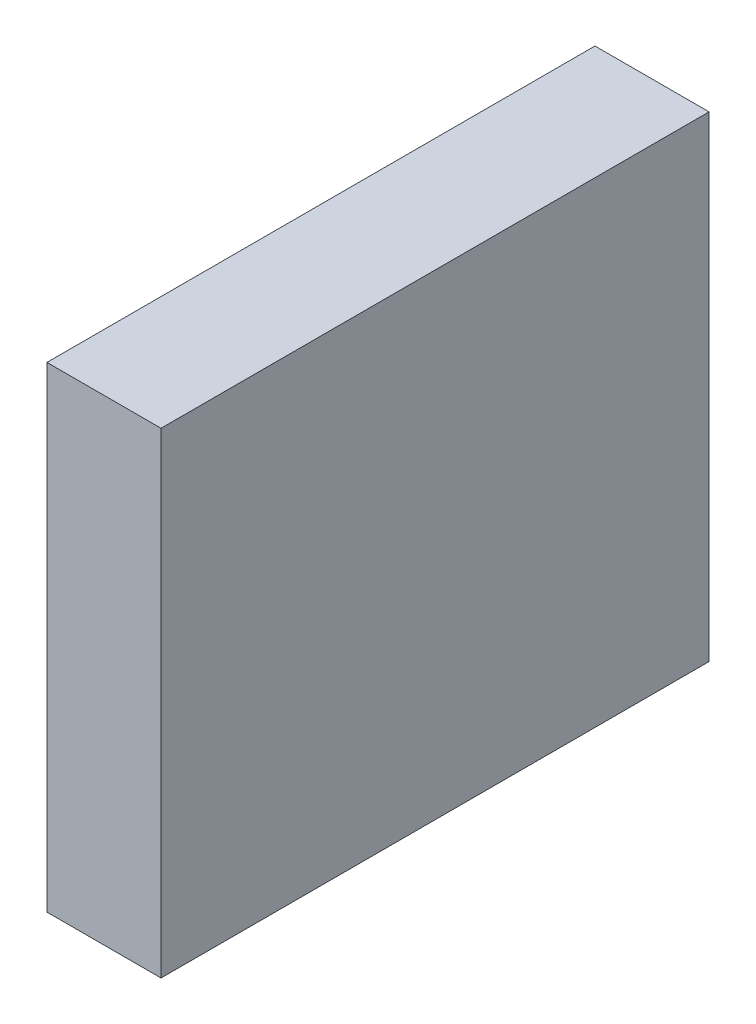
ISO-10303-21;
HEADER;
FILE_DESCRIPTION(('STEP AP214'),'2;1');
FILE_NAME('part.step','',(''),(''),'','','');
FILE_SCHEMA(('AUTOMOTIVE_DESIGN { 1 0 10303 214 1 1 1 1 }'));
ENDSEC;
DATA;
#1=APPLICATION_CONTEXT('core data for automotive mechanical design processes');
#2=APPLICATION_PROTOCOL_DEFINITION('international standard','automotive_design',2000,#1);
#3=PRODUCT_CONTEXT('',#1,'mechanical');
#4=PRODUCT('Part','Part','',(#3));
#5=PRODUCT_RELATED_PRODUCT_CATEGORY('part','',(#4));
#6=PRODUCT_DEFINITION_FORMATION('','',#4);
#7=PRODUCT_DEFINITION_CONTEXT('part definition',#1,'design');
#8=PRODUCT_DEFINITION('design','',#6,#7);
#9=PRODUCT_DEFINITION_SHAPE('','',#8);
#10=(LENGTH_UNIT() NAMED_UNIT(*) SI_UNIT(.MILLI.,.METRE.));
#11=(NAMED_UNIT(*) PLANE_ANGLE_UNIT() SI_UNIT($,.RADIAN.));
#12=(NAMED_UNIT(*) SI_UNIT($,.STERADIAN.) SOLID_ANGLE_UNIT());
#13=UNCERTAINTY_MEASURE_WITH_UNIT(LENGTH_MEASURE(1.E-05),#10,'distance_accuracy_value','');
#14=(GEOMETRIC_REPRESENTATION_CONTEXT(3) GLOBAL_UNCERTAINTY_ASSIGNED_CONTEXT((#13)) GLOBAL_UNIT_ASSIGNED_CONTEXT((#10,
#11,#12)) REPRESENTATION_CONTEXT('',''));
#15=CARTESIAN_POINT('',(0.,0.,0.));
#16=DIRECTION('',(0.,0.,1.));
#17=DIRECTION('',(1.,0.,0.));
#18=AXIS2_PLACEMENT_3D('',#15,#16,#17);
#19=CARTESIAN_POINT('',(0.,96.,0.));
#20=DIRECTION('',(1.,0.,0.));
#21=DIRECTION('',(0.,0.,-1.));
#22=AXIS2_PLACEMENT_3D('',#19,#20,#21);
#23=PLANE('',#22);
#24=DIRECTION('',(0.,0.,1.));
#25=VECTOR('',#24,1.);
#26=CARTESIAN_POINT('',(0.,0.,0.));
#27=LINE('',#26,#25);
#28=CARTESIAN_POINT('',(0.,0.,-110.5));
#29=VERTEX_POINT('',#28);
#30=CARTESIAN_POINT('',(0.,0.,0.));
#31=VERTEX_POINT('',#30);
#32=EDGE_CURVE('E106',#29,#31,#27,.T.);
#33=ORIENTED_EDGE('',*,*,#32,.T.);
#34=DIRECTION('',(0.,-1.,0.));
#35=VECTOR('',#34,1.);
#36=CARTESIAN_POINT('',(0.,96.,0.));
#37=LINE('',#36,#35);
#38=CARTESIAN_POINT('',(0.,96.,0.));
#39=VERTEX_POINT('',#38);
#40=EDGE_CURVE('E11',#39,#31,#37,.T.);
#41=ORIENTED_EDGE('',*,*,#40,.F.);
#42=DIRECTION('',(0.,0.,1.));
#43=VECTOR('',#42,1.);
#44=CARTESIAN_POINT('',(0.,96.,0.));
#45=LINE('',#44,#43);
#46=CARTESIAN_POINT('',(0.,96.,-110.5));
#47=VERTEX_POINT('',#46);
#48=EDGE_CURVE('E94',#47,#39,#45,.T.);
#49=ORIENTED_EDGE('',*,*,#48,.F.);
#50=DIRECTION('',(0.,-1.,0.));
#51=VECTOR('',#50,1.);
#52=CARTESIAN_POINT('',(0.,96.,-110.5));
#53=LINE('',#52,#51);
#54=EDGE_CURVE('E102',#47,#29,#53,.T.);
#55=ORIENTED_EDGE('',*,*,#54,.T.);
#56=EDGE_LOOP('',(#33,#41,#49,#55));
#57=FACE_BOUND('',#56,.T.);
#58=ADVANCED_FACE('F43',(#57),#23,.F.);
#59=CARTESIAN_POINT('',(0.,96.,0.));
#60=DIRECTION('',(0.,0.,-1.));
#61=DIRECTION('',(-1.,0.,0.));
#62=AXIS2_PLACEMENT_3D('',#59,#60,#61);
#63=PLANE('',#62);
#64=DIRECTION('',(1.,0.,0.));
#65=VECTOR('',#64,1.);
#66=CARTESIAN_POINT('',(0.,0.,0.));
#67=LINE('',#66,#65);
#68=CARTESIAN_POINT('',(23.,0.,0.));
#69=VERTEX_POINT('',#68);
#70=EDGE_CURVE('E98',#31,#69,#67,.T.);
#71=ORIENTED_EDGE('',*,*,#70,.T.);
#72=DIRECTION('',(0.,-1.,0.));
#73=VECTOR('',#72,1.);
#74=CARTESIAN_POINT('',(23.,96.,0.));
#75=LINE('',#74,#73);
#76=CARTESIAN_POINT('',(23.,96.,0.));
#77=VERTEX_POINT('',#76);
#78=EDGE_CURVE('E51',#77,#69,#75,.T.);
#79=ORIENTED_EDGE('',*,*,#78,.F.);
#80=DIRECTION('',(1.,0.,0.));
#81=VECTOR('',#80,1.);
#82=CARTESIAN_POINT('',(0.,96.,0.));
#83=LINE('',#82,#81);
#84=EDGE_CURVE('E89',#39,#77,#83,.T.);
#85=ORIENTED_EDGE('',*,*,#84,.F.);
#86=ORIENTED_EDGE('',*,*,#40,.T.);
#87=EDGE_LOOP('',(#71,#79,#85,#86));
#88=FACE_BOUND('',#87,.T.);
#89=ADVANCED_FACE('F97',(#88),#63,.F.);
#90=CARTESIAN_POINT('',(23.,96.,0.));
#91=DIRECTION('',(-1.,0.,0.));
#92=DIRECTION('',(0.,0.,1.));
#93=AXIS2_PLACEMENT_3D('',#90,#91,#92);
#94=PLANE('',#93);
#95=DIRECTION('',(0.,0.,-1.));
#96=VECTOR('',#95,1.);
#97=CARTESIAN_POINT('',(23.,0.,0.));
#98=LINE('',#97,#96);
#99=CARTESIAN_POINT('',(23.,0.,-110.5));
#100=VERTEX_POINT('',#99);
#101=EDGE_CURVE('E76',#69,#100,#98,.T.);
#102=ORIENTED_EDGE('',*,*,#101,.T.);
#103=DIRECTION('',(0.,-1.,0.));
#104=VECTOR('',#103,1.);
#105=CARTESIAN_POINT('',(23.,96.,-110.5));
#106=LINE('',#105,#104);
#107=CARTESIAN_POINT('',(23.,96.,-110.5));
#108=VERTEX_POINT('',#107);
#109=EDGE_CURVE('E99',#108,#100,#106,.T.);
#110=ORIENTED_EDGE('',*,*,#109,.F.);
#111=DIRECTION('',(0.,0.,-1.));
#112=VECTOR('',#111,1.);
#113=CARTESIAN_POINT('',(23.,96.,0.));
#114=LINE('',#113,#112);
#115=EDGE_CURVE('E92',#77,#108,#114,.T.);
#116=ORIENTED_EDGE('',*,*,#115,.F.);
#117=ORIENTED_EDGE('',*,*,#78,.T.);
#118=EDGE_LOOP('',(#102,#110,#116,#117));
#119=FACE_BOUND('',#118,.T.);
#120=ADVANCED_FACE('F100',(#119),#94,.F.);
#121=CARTESIAN_POINT('',(0.,96.,-110.5));
#122=DIRECTION('',(0.,0.,1.));
#123=DIRECTION('',(1.,0.,0.));
#124=AXIS2_PLACEMENT_3D('',#121,#122,#123);
#125=PLANE('',#124);
#126=DIRECTION('',(-1.,0.,0.));
#127=VECTOR('',#126,1.);
#128=CARTESIAN_POINT('',(0.,0.,-110.5));
#129=LINE('',#128,#127);
#130=EDGE_CURVE('E82',#100,#29,#129,.T.);
#131=ORIENTED_EDGE('',*,*,#130,.T.);
#132=ORIENTED_EDGE('',*,*,#54,.F.);
#133=DIRECTION('',(-1.,0.,0.));
#134=VECTOR('',#133,1.);
#135=CARTESIAN_POINT('',(0.,96.,-110.5));
#136=LINE('',#135,#134);
#137=EDGE_CURVE('E59',#108,#47,#136,.T.);
#138=ORIENTED_EDGE('',*,*,#137,.F.);
#139=ORIENTED_EDGE('',*,*,#109,.T.);
#140=EDGE_LOOP('',(#131,#132,#138,#139));
#141=FACE_BOUND('',#140,.T.);
#142=ADVANCED_FACE('F113',(#141),#125,.F.);
#143=CARTESIAN_POINT('',(0.,96.,0.));
#144=DIRECTION('',(0.,-1.,0.));
#145=DIRECTION('',(0.,0.,-1.));
#146=AXIS2_PLACEMENT_3D('',#143,#144,#145);
#147=PLANE('',#146);
#148=ORIENTED_EDGE('',*,*,#48,.T.);
#149=ORIENTED_EDGE('',*,*,#84,.T.);
#150=ORIENTED_EDGE('',*,*,#115,.T.);
#151=ORIENTED_EDGE('',*,*,#137,.T.);
#152=EDGE_LOOP('',(#148,#149,#150,#151));
#153=FACE_BOUND('',#152,.T.);
#154=ADVANCED_FACE('F90',(#153),#147,.F.);
#155=CARTESIAN_POINT('',(0.,0.,0.));
#156=DIRECTION('',(0.,-1.,0.));
#157=DIRECTION('',(0.,0.,-1.));
#158=AXIS2_PLACEMENT_3D('',#155,#156,#157);
#159=PLANE('',#158);
#160=ORIENTED_EDGE('',*,*,#32,.F.);
#161=ORIENTED_EDGE('',*,*,#130,.F.);
#162=ORIENTED_EDGE('',*,*,#101,.F.);
#163=ORIENTED_EDGE('',*,*,#70,.F.);
#164=EDGE_LOOP('',(#160,#161,#162,#163));
#165=FACE_BOUND('',#164,.T.);
#166=ADVANCED_FACE('F116',(#165),#159,.T.);
#167=CLOSED_SHELL('',(#58,#89,#120,#142,#154,#166));
#168=MANIFOLD_SOLID_BREP('B2',#167);
#169=ADVANCED_BREP_SHAPE_REPRESENTATION('',(#18,#168),#14);
#170=SHAPE_DEFINITION_REPRESENTATION(#9,#169);
ENDSEC;
END-ISO-10303-21;
